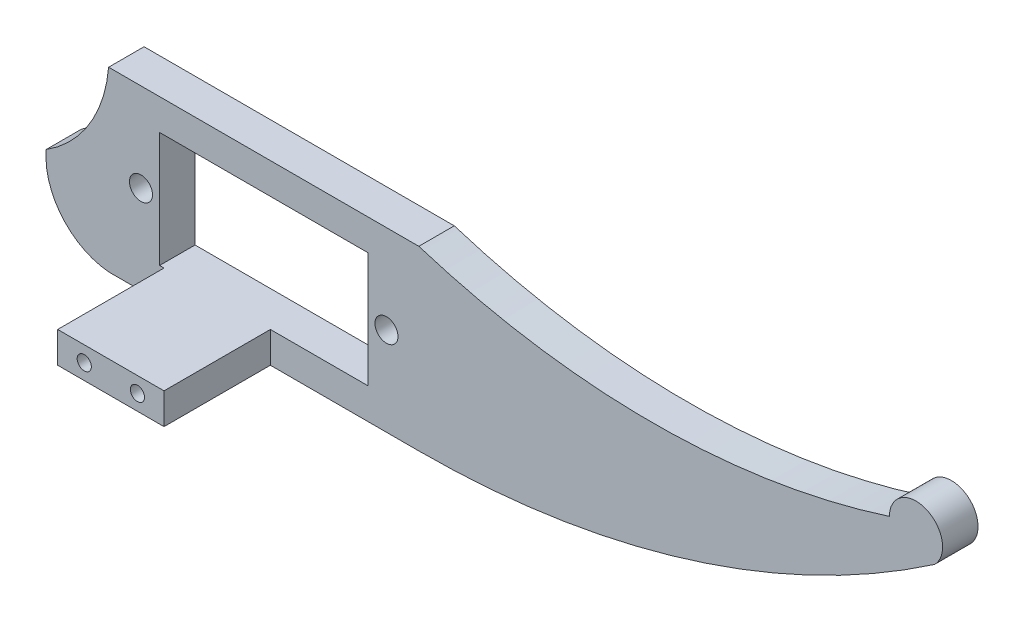
ISO-10303-21;
HEADER;
FILE_DESCRIPTION(('STEP AP214'),'2;1');
FILE_NAME('part.step','',(''),(''),'','','');
FILE_SCHEMA(('AUTOMOTIVE_DESIGN { 1 0 10303 214 1 1 1 1 }'));
ENDSEC;
DATA;
#1=APPLICATION_CONTEXT('core data for automotive mechanical design processes');
#2=APPLICATION_PROTOCOL_DEFINITION('international standard','automotive_design',2000,#1);
#3=PRODUCT_CONTEXT('',#1,'mechanical');
#4=PRODUCT('Part','Part','',(#3));
#5=PRODUCT_RELATED_PRODUCT_CATEGORY('part','',(#4));
#6=PRODUCT_DEFINITION_FORMATION('','',#4);
#7=PRODUCT_DEFINITION_CONTEXT('part definition',#1,'design');
#8=PRODUCT_DEFINITION('design','',#6,#7);
#9=PRODUCT_DEFINITION_SHAPE('','',#8);
#10=(LENGTH_UNIT() NAMED_UNIT(*) SI_UNIT(.MILLI.,.METRE.));
#11=(NAMED_UNIT(*) PLANE_ANGLE_UNIT() SI_UNIT($,.RADIAN.));
#12=(NAMED_UNIT(*) SI_UNIT($,.STERADIAN.) SOLID_ANGLE_UNIT());
#13=UNCERTAINTY_MEASURE_WITH_UNIT(LENGTH_MEASURE(1.E-05),#10,'distance_accuracy_value','');
#14=(GEOMETRIC_REPRESENTATION_CONTEXT(3) GLOBAL_UNCERTAINTY_ASSIGNED_CONTEXT((#13)) GLOBAL_UNIT_ASSIGNED_CONTEXT((#10,
#11,#12)) REPRESENTATION_CONTEXT('',''));
#15=CARTESIAN_POINT('',(0.,0.,0.));
#16=DIRECTION('',(0.,0.,1.));
#17=DIRECTION('',(1.,0.,0.));
#18=AXIS2_PLACEMENT_3D('',#15,#16,#17);
#19=CARTESIAN_POINT('',(0.,0.,4.));
#20=DIRECTION('',(0.,0.,1.));
#21=DIRECTION('',(1.,0.,0.));
#22=AXIS2_PLACEMENT_3D('',#19,#20,#21);
#23=PLANE('',#22);
#24=CARTESIAN_POINT('',(21.2104677769309,-2.6376373313008,4.));
#25=DIRECTION('',(0.,0.,1.));
#26=DIRECTION('',(1.,0.,0.));
#27=AXIS2_PLACEMENT_3D('',#24,#25,#26);
#28=CIRCLE('',#27,1.3);
#29=CARTESIAN_POINT('',(22.5104677769309,-2.6376373313008,4.));
#30=VERTEX_POINT('',#29);
#31=EDGE_CURVE('E346',#30,#30,#28,.T.);
#32=ORIENTED_EDGE('',*,*,#31,.F.);
#33=EDGE_LOOP('',(#32));
#34=FACE_BOUND('',#33,.T.);
#35=CARTESIAN_POINT('',(-6.48953222306909,-2.63763733130083,4.));
#36=DIRECTION('',(0.,0.,1.));
#37=DIRECTION('',(1.,0.,0.));
#38=AXIS2_PLACEMENT_3D('',#35,#36,#37);
#39=CIRCLE('',#38,1.3);
#40=CARTESIAN_POINT('',(-5.18953222306909,-2.63763733130083,4.));
#41=VERTEX_POINT('',#40);
#42=EDGE_CURVE('E342',#41,#41,#39,.T.);
#43=ORIENTED_EDGE('',*,*,#42,.F.);
#44=EDGE_LOOP('',(#43));
#45=FACE_BOUND('',#44,.T.);
#46=DIRECTION('',(1.,0.,0.));
#47=VECTOR('',#46,1.);
#48=CARTESIAN_POINT('',(0.,-9.1376373313008,4.));
#49=LINE('',#48,#47);
#50=CARTESIAN_POINT('',(8.11046777693084,-9.1376373313008,4.));
#51=VERTEX_POINT('',#50);
#52=CARTESIAN_POINT('',(19.1104677769309,-9.1376373313008,4.));
#53=VERTEX_POINT('',#52);
#54=EDGE_CURVE('E315',#51,#53,#49,.T.);
#55=ORIENTED_EDGE('',*,*,#54,.F.);
#56=DIRECTION('',(0.,-1.,0.));
#57=VECTOR('',#56,1.);
#58=CARTESIAN_POINT('',(8.11046777693084,-9.1376373313008,4.));
#59=LINE('',#58,#57);
#60=CARTESIAN_POINT('',(8.11046777693084,-12.6376373313008,4.));
#61=VERTEX_POINT('',#60);
#62=EDGE_CURVE('E320',#51,#61,#59,.T.);
#63=ORIENTED_EDGE('',*,*,#62,.T.);
#64=DIRECTION('',(1.,0.,0.));
#65=VECTOR('',#64,1.);
#66=CARTESIAN_POINT('',(0.,-12.6376373313008,4.));
#67=LINE('',#66,#65);
#68=CARTESIAN_POINT('',(24.8604677769309,-12.6376373313008,4.));
#69=VERTEX_POINT('',#68);
#70=EDGE_CURVE('E288',#61,#69,#67,.T.);
#71=ORIENTED_EDGE('',*,*,#70,.T.);
#72=CARTESIAN_POINT('',(24.8604677769309,90.3991290333978,4.));
#73=DIRECTION('',(0.,0.,1.));
#74=DIRECTION('',(1.,0.,0.));
#75=AXIS2_PLACEMENT_3D('',#72,#73,#74);
#76=CIRCLE('',#75,103.036766364699);
#77=CARTESIAN_POINT('',(83.0359638887343,5.35686380581207,4.));
#78=VERTEX_POINT('',#77);
#79=EDGE_CURVE('E287',#69,#78,#76,.T.);
#80=ORIENTED_EDGE('',*,*,#79,.T.);
#81=CARTESIAN_POINT('',(80.9569407255194,7.51965429192378,4.));
#82=DIRECTION('',(0.,0.,1.));
#83=DIRECTION('',(1.,0.,0.));
#84=AXIS2_PLACEMENT_3D('',#81,#82,#83);
#85=CIRCLE('',#84,2.99999999999991);
#86=CARTESIAN_POINT('',(77.9569407255195,7.51965429192378,4.));
#87=VERTEX_POINT('',#86);
#88=EDGE_CURVE('E165',#78,#87,#85,.T.);
#89=ORIENTED_EDGE('',*,*,#88,.T.);
#90=CARTESIAN_POINT('',(51.1624750782054,90.5598698435227,4.));
#91=DIRECTION('',(0.,0.,1.));
#92=DIRECTION('',(1.,0.,0.));
#93=AXIS2_PLACEMENT_3D('',#90,#91,#92);
#94=CIRCLE('',#93,87.2560644779553);
#95=CARTESIAN_POINT('',(24.8604677769309,7.3623626686992,4.));
#96=VERTEX_POINT('',#95);
#97=EDGE_CURVE('E163',#96,#87,#94,.T.);
#98=ORIENTED_EDGE('',*,*,#97,.F.);
#99=DIRECTION('',(1.,0.,0.));
#100=VECTOR('',#99,1.);
#101=CARTESIAN_POINT('',(0.,7.3623626686992,4.));
#102=LINE('',#101,#100);
#103=CARTESIAN_POINT('',(-10.1395322230691,7.3623626686992,4.));
#104=VERTEX_POINT('',#103);
#105=EDGE_CURVE('E144',#104,#96,#102,.T.);
#106=ORIENTED_EDGE('',*,*,#105,.F.);
#107=CARTESIAN_POINT('',(-25.2144187686787,8.61927416825423,4.));
#108=DIRECTION('',(0.,0.,1.));
#109=DIRECTION('',(1.,0.,0.));
#110=AXIS2_PLACEMENT_3D('',#107,#108,#109);
#111=CIRCLE('',#110,15.1271950764415);
#112=CARTESIAN_POINT('',(-17.1781884954032,-4.19677178498755,4.));
#113=VERTEX_POINT('',#112);
#114=EDGE_CURVE('E154',#104,#113,#111,.F.);
#115=ORIENTED_EDGE('',*,*,#114,.T.);
#116=CARTESIAN_POINT('',(-9.43842758607949,-4.89787642197714,4.));
#117=DIRECTION('',(0.,0.,1.));
#118=DIRECTION('',(1.,0.,0.));
#119=AXIS2_PLACEMENT_3D('',#116,#117,#118);
#120=CIRCLE('',#119,7.77145074265435);
#121=CARTESIAN_POINT('',(-10.1395322230691,-12.6376373313008,4.));
#122=VERTEX_POINT('',#121);
#123=EDGE_CURVE('E158',#122,#113,#120,.F.);
#124=ORIENTED_EDGE('',*,*,#123,.F.);
#125=CARTESIAN_POINT('',(-3.88953222306916,-12.6376373313008,4.));
#126=VERTEX_POINT('',#125);
#127=EDGE_CURVE('E283',#122,#126,#67,.T.);
#128=ORIENTED_EDGE('',*,*,#127,.T.);
#129=DIRECTION('',(0.,1.,0.));
#130=VECTOR('',#129,1.);
#131=CARTESIAN_POINT('',(-3.88953222306916,-9.1376373313008,4.));
#132=LINE('',#131,#130);
#133=CARTESIAN_POINT('',(-3.88953222306916,-9.1376373313008,4.));
#134=VERTEX_POINT('',#133);
#135=EDGE_CURVE('E284',#126,#134,#132,.T.);
#136=ORIENTED_EDGE('',*,*,#135,.T.);
#137=CARTESIAN_POINT('',(-4.38953222306909,-9.1376373313008,4.));
#138=VERTEX_POINT('',#137);
#139=EDGE_CURVE('E323',#138,#134,#49,.T.);
#140=ORIENTED_EDGE('',*,*,#139,.F.);
#141=DIRECTION('',(0.,-1.,0.));
#142=VECTOR('',#141,1.);
#143=CARTESIAN_POINT('',(-4.38953222306909,0.,4.));
#144=LINE('',#143,#142);
#145=CARTESIAN_POINT('',(-4.38953222306909,3.8623626686992,4.));
#146=VERTEX_POINT('',#145);
#147=EDGE_CURVE('E226',#146,#138,#144,.T.);
#148=ORIENTED_EDGE('',*,*,#147,.F.);
#149=DIRECTION('',(1.,0.,0.));
#150=VECTOR('',#149,1.);
#151=CARTESIAN_POINT('',(0.,3.8623626686992,4.));
#152=LINE('',#151,#150);
#153=CARTESIAN_POINT('',(19.1104677769309,3.8623626686992,4.));
#154=VERTEX_POINT('',#153);
#155=EDGE_CURVE('E200',#146,#154,#152,.T.);
#156=ORIENTED_EDGE('',*,*,#155,.T.);
#157=DIRECTION('',(0.,-1.,0.));
#158=VECTOR('',#157,1.);
#159=CARTESIAN_POINT('',(19.1104677769309,0.,4.));
#160=LINE('',#159,#158);
#161=EDGE_CURVE('E111',#154,#53,#160,.T.);
#162=ORIENTED_EDGE('',*,*,#161,.T.);
#163=EDGE_LOOP('',(#55,#63,#71,#80,#89,#98,#106,#115,#124,#128,#136,#140,#148,#156,#162));
#164=FACE_BOUND('',#163,.T.);
#165=ADVANCED_FACE('F36',(#34,#45,#164),#23,.T.);
#166=CARTESIAN_POINT('',(0.,-12.6376373313008,4.));
#167=DIRECTION('',(0.,1.,0.));
#168=DIRECTION('',(0.,0.,1.));
#169=AXIS2_PLACEMENT_3D('',#166,#167,#168);
#170=PLANE('',#169);
#171=DIRECTION('',(1.,0.,0.));
#172=VECTOR('',#171,1.);
#173=CARTESIAN_POINT('',(0.,-12.6376373313008,0.));
#174=LINE('',#173,#172);
#175=CARTESIAN_POINT('',(-10.1395322230691,-12.6376373313008,0.));
#176=VERTEX_POINT('',#175);
#177=CARTESIAN_POINT('',(24.8604677769309,-12.6376373313008,0.));
#178=VERTEX_POINT('',#177);
#179=EDGE_CURVE('E184',#176,#178,#174,.T.);
#180=ORIENTED_EDGE('',*,*,#179,.T.);
#181=DIRECTION('',(0.,0.,-1.));
#182=VECTOR('',#181,1.);
#183=CARTESIAN_POINT('',(24.8604677769309,-12.6376373313008,4.));
#184=LINE('',#183,#182);
#185=EDGE_CURVE('E11',#69,#178,#184,.T.);
#186=ORIENTED_EDGE('',*,*,#185,.F.);
#187=ORIENTED_EDGE('',*,*,#70,.F.);
#188=DIRECTION('',(0.,0.,-1.));
#189=VECTOR('',#188,1.);
#190=CARTESIAN_POINT('',(8.11046777693084,-12.6376373313008,16.));
#191=LINE('',#190,#189);
#192=CARTESIAN_POINT('',(8.11046777693084,-12.6376373313008,16.));
#193=VERTEX_POINT('',#192);
#194=EDGE_CURVE('E299',#193,#61,#191,.T.);
#195=ORIENTED_EDGE('',*,*,#194,.F.);
#196=DIRECTION('',(-1.,0.,0.));
#197=VECTOR('',#196,1.);
#198=CARTESIAN_POINT('',(8.11046777693084,-12.6376373313008,16.));
#199=LINE('',#198,#197);
#200=CARTESIAN_POINT('',(-3.88953222306916,-12.6376373313008,16.));
#201=VERTEX_POINT('',#200);
#202=EDGE_CURVE('E336',#193,#201,#199,.T.);
#203=ORIENTED_EDGE('',*,*,#202,.T.);
#204=DIRECTION('',(0.,0.,-1.));
#205=VECTOR('',#204,1.);
#206=CARTESIAN_POINT('',(-3.88953222306916,-12.6376373313008,16.));
#207=LINE('',#206,#205);
#208=EDGE_CURVE('E328',#201,#126,#207,.T.);
#209=ORIENTED_EDGE('',*,*,#208,.T.);
#210=ORIENTED_EDGE('',*,*,#127,.F.);
#211=DIRECTION('',(0.,0.,-1.));
#212=VECTOR('',#211,1.);
#213=CARTESIAN_POINT('',(-10.1395322230691,-12.6376373313008,4.));
#214=LINE('',#213,#212);
#215=EDGE_CURVE('E62',#122,#176,#214,.T.);
#216=ORIENTED_EDGE('',*,*,#215,.T.);
#217=EDGE_LOOP('',(#180,#186,#187,#195,#203,#209,#210,#216));
#218=FACE_BOUND('',#217,.T.);
#219=ADVANCED_FACE('F239',(#218),#170,.F.);
#220=CARTESIAN_POINT('',(24.8604677769309,90.3991290333978,4.));
#221=DIRECTION('',(0.,0.,-1.));
#222=DIRECTION('',(-1.,0.,0.));
#223=AXIS2_PLACEMENT_3D('',#220,#221,#222);
#224=CYLINDRICAL_SURFACE('',#223,103.036766364699);
#225=CARTESIAN_POINT('',(24.8604677769309,90.3991290333978,0.));
#226=DIRECTION('',(0.,0.,1.));
#227=DIRECTION('',(1.,0.,0.));
#228=AXIS2_PLACEMENT_3D('',#225,#226,#227);
#229=CIRCLE('',#228,103.036766364699);
#230=CARTESIAN_POINT('',(83.0359638887343,5.35686380581207,0.));
#231=VERTEX_POINT('',#230);
#232=EDGE_CURVE('E186',#178,#231,#229,.T.);
#233=ORIENTED_EDGE('',*,*,#232,.T.);
#234=DIRECTION('',(0.,0.,-1.));
#235=VECTOR('',#234,1.);
#236=CARTESIAN_POINT('',(83.0359638887343,5.35686380581207,4.));
#237=LINE('',#236,#235);
#238=EDGE_CURVE('E45',#78,#231,#237,.T.);
#239=ORIENTED_EDGE('',*,*,#238,.F.);
#240=ORIENTED_EDGE('',*,*,#79,.F.);
#241=ORIENTED_EDGE('',*,*,#185,.T.);
#242=EDGE_LOOP('',(#233,#239,#240,#241));
#243=FACE_BOUND('',#242,.T.);
#244=ADVANCED_FACE('F245',(#243),#224,.T.);
#245=CARTESIAN_POINT('',(80.9569407255194,7.51965429192378,4.));
#246=DIRECTION('',(0.,0.,-1.));
#247=DIRECTION('',(-1.,0.,0.));
#248=AXIS2_PLACEMENT_3D('',#245,#246,#247);
#249=CYLINDRICAL_SURFACE('',#248,2.99999999999991);
#250=CARTESIAN_POINT('',(80.9569407255194,7.51965429192378,0.));
#251=DIRECTION('',(0.,0.,1.));
#252=DIRECTION('',(1.,0.,0.));
#253=AXIS2_PLACEMENT_3D('',#250,#251,#252);
#254=CIRCLE('',#253,2.99999999999991);
#255=CARTESIAN_POINT('',(77.9569407255195,7.51965429192378,0.));
#256=VERTEX_POINT('',#255);
#257=EDGE_CURVE('E188',#231,#256,#254,.T.);
#258=ORIENTED_EDGE('',*,*,#257,.T.);
#259=DIRECTION('',(0.,0.,-1.));
#260=VECTOR('',#259,1.);
#261=CARTESIAN_POINT('',(77.9569407255195,7.51965429192378,4.));
#262=LINE('',#261,#260);
#263=EDGE_CURVE('E204',#87,#256,#262,.T.);
#264=ORIENTED_EDGE('',*,*,#263,.F.);
#265=ORIENTED_EDGE('',*,*,#88,.F.);
#266=ORIENTED_EDGE('',*,*,#238,.T.);
#267=EDGE_LOOP('',(#258,#264,#265,#266));
#268=FACE_BOUND('',#267,.T.);
#269=ADVANCED_FACE('F265',(#268),#249,.T.);
#270=CARTESIAN_POINT('',(51.1624750782054,90.5598698435227,4.));
#271=DIRECTION('',(0.,0.,-1.));
#272=DIRECTION('',(-1.,0.,0.));
#273=AXIS2_PLACEMENT_3D('',#270,#271,#272);
#274=CYLINDRICAL_SURFACE('',#273,87.2560644779553);
#275=CARTESIAN_POINT('',(51.1624750782054,90.5598698435227,0.));
#276=DIRECTION('',(0.,0.,1.));
#277=DIRECTION('',(1.,0.,0.));
#278=AXIS2_PLACEMENT_3D('',#275,#276,#277);
#279=CIRCLE('',#278,87.2560644779553);
#280=CARTESIAN_POINT('',(24.8604677769309,7.3623626686992,0.));
#281=VERTEX_POINT('',#280);
#282=EDGE_CURVE('E191',#281,#256,#279,.T.);
#283=ORIENTED_EDGE('',*,*,#282,.F.);
#284=DIRECTION('',(0.,0.,-1.));
#285=VECTOR('',#284,1.);
#286=CARTESIAN_POINT('',(24.8604677769309,7.3623626686992,4.));
#287=LINE('',#286,#285);
#288=EDGE_CURVE('E150',#96,#281,#287,.T.);
#289=ORIENTED_EDGE('',*,*,#288,.F.);
#290=ORIENTED_EDGE('',*,*,#97,.T.);
#291=ORIENTED_EDGE('',*,*,#263,.T.);
#292=EDGE_LOOP('',(#283,#289,#290,#291));
#293=FACE_BOUND('',#292,.T.);
#294=ADVANCED_FACE('F262',(#293),#274,.F.);
#295=CARTESIAN_POINT('',(0.,7.3623626686992,4.));
#296=DIRECTION('',(0.,1.,0.));
#297=DIRECTION('',(0.,0.,1.));
#298=AXIS2_PLACEMENT_3D('',#295,#296,#297);
#299=PLANE('',#298);
#300=DIRECTION('',(1.,0.,0.));
#301=VECTOR('',#300,1.);
#302=CARTESIAN_POINT('',(0.,7.3623626686992,0.));
#303=LINE('',#302,#301);
#304=CARTESIAN_POINT('',(-10.1395322230691,7.3623626686992,0.));
#305=VERTEX_POINT('',#304);
#306=EDGE_CURVE('E146',#305,#281,#303,.T.);
#307=ORIENTED_EDGE('',*,*,#306,.F.);
#308=DIRECTION('',(0.,0.,-1.));
#309=VECTOR('',#308,1.);
#310=CARTESIAN_POINT('',(-10.1395322230691,7.3623626686992,4.));
#311=LINE('',#310,#309);
#312=EDGE_CURVE('E140',#104,#305,#311,.T.);
#313=ORIENTED_EDGE('',*,*,#312,.F.);
#314=ORIENTED_EDGE('',*,*,#105,.T.);
#315=ORIENTED_EDGE('',*,*,#288,.T.);
#316=EDGE_LOOP('',(#307,#313,#314,#315));
#317=FACE_BOUND('',#316,.T.);
#318=ADVANCED_FACE('F142',(#317),#299,.T.);
#319=CARTESIAN_POINT('',(-25.2144187686787,8.61927416825423,4.));
#320=DIRECTION('',(0.,0.,-1.));
#321=DIRECTION('',(-1.,0.,0.));
#322=AXIS2_PLACEMENT_3D('',#319,#320,#321);
#323=CYLINDRICAL_SURFACE('',#322,15.1271950764415);
#324=CARTESIAN_POINT('',(-25.2144187686787,8.61927416825423,0.));
#325=DIRECTION('',(0.,0.,1.));
#326=DIRECTION('',(1.,0.,0.));
#327=AXIS2_PLACEMENT_3D('',#324,#325,#326);
#328=CIRCLE('',#327,15.1271950764415);
#329=CARTESIAN_POINT('',(-17.1781884954032,-4.19677178498755,0.));
#330=VERTEX_POINT('',#329);
#331=EDGE_CURVE('E195',#305,#330,#328,.F.);
#332=ORIENTED_EDGE('',*,*,#331,.T.);
#333=DIRECTION('',(0.,0.,-1.));
#334=VECTOR('',#333,1.);
#335=CARTESIAN_POINT('',(-17.1781884954032,-4.19677178498755,4.));
#336=LINE('',#335,#334);
#337=EDGE_CURVE('E151',#113,#330,#336,.T.);
#338=ORIENTED_EDGE('',*,*,#337,.F.);
#339=ORIENTED_EDGE('',*,*,#114,.F.);
#340=ORIENTED_EDGE('',*,*,#312,.T.);
#341=EDGE_LOOP('',(#332,#338,#339,#340));
#342=FACE_BOUND('',#341,.T.);
#343=ADVANCED_FACE('F155',(#342),#323,.F.);
#344=CARTESIAN_POINT('',(0.,3.8623626686992,4.));
#345=DIRECTION('',(0.,1.,0.));
#346=DIRECTION('',(-1.,0.,0.));
#347=AXIS2_PLACEMENT_3D('',#344,#345,#346);
#348=PLANE('',#347);
#349=DIRECTION('',(1.,0.,0.));
#350=VECTOR('',#349,1.);
#351=CARTESIAN_POINT('',(0.,3.8623626686992,0.));
#352=LINE('',#351,#350);
#353=CARTESIAN_POINT('',(-4.38953222306909,3.8623626686992,0.));
#354=VERTEX_POINT('',#353);
#355=CARTESIAN_POINT('',(19.1104677769309,3.8623626686992,0.));
#356=VERTEX_POINT('',#355);
#357=EDGE_CURVE('E171',#354,#356,#352,.T.);
#358=ORIENTED_EDGE('',*,*,#357,.T.);
#359=DIRECTION('',(0.,0.,-1.));
#360=VECTOR('',#359,1.);
#361=CARTESIAN_POINT('',(19.1104677769309,3.8623626686992,4.));
#362=LINE('',#361,#360);
#363=EDGE_CURVE('E40',#154,#356,#362,.T.);
#364=ORIENTED_EDGE('',*,*,#363,.F.);
#365=ORIENTED_EDGE('',*,*,#155,.F.);
#366=DIRECTION('',(0.,0.,-1.));
#367=VECTOR('',#366,1.);
#368=CARTESIAN_POINT('',(-4.38953222306909,3.8623626686992,4.));
#369=LINE('',#368,#367);
#370=EDGE_CURVE('E170',#146,#354,#369,.T.);
#371=ORIENTED_EDGE('',*,*,#370,.T.);
#372=EDGE_LOOP('',(#358,#364,#365,#371));
#373=FACE_BOUND('',#372,.T.);
#374=ADVANCED_FACE('F38',(#373),#348,.F.);
#375=CARTESIAN_POINT('',(19.1104677769309,0.,4.));
#376=DIRECTION('',(1.,0.,0.));
#377=DIRECTION('',(0.,1.,0.));
#378=AXIS2_PLACEMENT_3D('',#375,#376,#377);
#379=PLANE('',#378);
#380=DIRECTION('',(0.,-1.,0.));
#381=VECTOR('',#380,1.);
#382=CARTESIAN_POINT('',(19.1104677769309,0.,0.));
#383=LINE('',#382,#381);
#384=CARTESIAN_POINT('',(19.1104677769309,-9.1376373313008,0.));
#385=VERTEX_POINT('',#384);
#386=EDGE_CURVE('E174',#356,#385,#383,.T.);
#387=ORIENTED_EDGE('',*,*,#386,.T.);
#388=DIRECTION('',(0.,0.,-1.));
#389=VECTOR('',#388,1.);
#390=CARTESIAN_POINT('',(19.1104677769309,-9.1376373313008,4.));
#391=LINE('',#390,#389);
#392=EDGE_CURVE('E210',#53,#385,#391,.T.);
#393=ORIENTED_EDGE('',*,*,#392,.F.);
#394=ORIENTED_EDGE('',*,*,#161,.F.);
#395=ORIENTED_EDGE('',*,*,#363,.T.);
#396=EDGE_LOOP('',(#387,#393,#394,#395));
#397=FACE_BOUND('',#396,.T.);
#398=ADVANCED_FACE('F214',(#397),#379,.F.);
#399=CARTESIAN_POINT('',(0.,-9.1376373313008,4.));
#400=DIRECTION('',(0.,1.,0.));
#401=DIRECTION('',(0.,0.,1.));
#402=AXIS2_PLACEMENT_3D('',#399,#400,#401);
#403=PLANE('',#402);
#404=DIRECTION('',(1.,0.,0.));
#405=VECTOR('',#404,1.);
#406=CARTESIAN_POINT('',(0.,-9.1376373313008,0.));
#407=LINE('',#406,#405);
#408=CARTESIAN_POINT('',(-4.38953222306909,-9.1376373313008,0.));
#409=VERTEX_POINT('',#408);
#410=EDGE_CURVE('E178',#409,#385,#407,.T.);
#411=ORIENTED_EDGE('',*,*,#410,.F.);
#412=DIRECTION('',(0.,0.,-1.));
#413=VECTOR('',#412,1.);
#414=CARTESIAN_POINT('',(-4.38953222306909,-9.1376373313008,4.));
#415=LINE('',#414,#413);
#416=EDGE_CURVE('E209',#138,#409,#415,.T.);
#417=ORIENTED_EDGE('',*,*,#416,.F.);
#418=ORIENTED_EDGE('',*,*,#139,.T.);
#419=DIRECTION('',(0.,0.,-1.));
#420=VECTOR('',#419,1.);
#421=CARTESIAN_POINT('',(-3.88953222306916,-9.1376373313008,16.));
#422=LINE('',#421,#420);
#423=CARTESIAN_POINT('',(-3.88953222306916,-9.1376373313008,16.));
#424=VERTEX_POINT('',#423);
#425=EDGE_CURVE('E53',#424,#134,#422,.T.);
#426=ORIENTED_EDGE('',*,*,#425,.F.);
#427=DIRECTION('',(1.,0.,0.));
#428=VECTOR('',#427,1.);
#429=CARTESIAN_POINT('',(8.11046777693084,-9.1376373313008,16.));
#430=LINE('',#429,#428);
#431=CARTESIAN_POINT('',(8.11046777693084,-9.1376373313008,16.));
#432=VERTEX_POINT('',#431);
#433=EDGE_CURVE('E317',#424,#432,#430,.T.);
#434=ORIENTED_EDGE('',*,*,#433,.T.);
#435=DIRECTION('',(0.,0.,-1.));
#436=VECTOR('',#435,1.);
#437=CARTESIAN_POINT('',(8.11046777693084,-9.1376373313008,16.));
#438=LINE('',#437,#436);
#439=EDGE_CURVE('E175',#432,#51,#438,.T.);
#440=ORIENTED_EDGE('',*,*,#439,.T.);
#441=ORIENTED_EDGE('',*,*,#54,.T.);
#442=ORIENTED_EDGE('',*,*,#392,.T.);
#443=EDGE_LOOP('',(#411,#417,#418,#426,#434,#440,#441,#442));
#444=FACE_BOUND('',#443,.T.);
#445=ADVANCED_FACE('F229',(#444),#403,.T.);
#446=CARTESIAN_POINT('',(-4.38953222306909,0.,4.));
#447=DIRECTION('',(1.,0.,0.));
#448=DIRECTION('',(0.,1.,0.));
#449=AXIS2_PLACEMENT_3D('',#446,#447,#448);
#450=PLANE('',#449);
#451=DIRECTION('',(0.,-1.,0.));
#452=VECTOR('',#451,1.);
#453=CARTESIAN_POINT('',(-4.38953222306909,0.,0.));
#454=LINE('',#453,#452);
#455=EDGE_CURVE('E181',#354,#409,#454,.T.);
#456=ORIENTED_EDGE('',*,*,#455,.F.);
#457=ORIENTED_EDGE('',*,*,#370,.F.);
#458=ORIENTED_EDGE('',*,*,#147,.T.);
#459=ORIENTED_EDGE('',*,*,#416,.T.);
#460=EDGE_LOOP('',(#456,#457,#458,#459));
#461=FACE_BOUND('',#460,.T.);
#462=ADVANCED_FACE('F223',(#461),#450,.T.);
#463=CARTESIAN_POINT('',(-9.43842758607949,-4.89787642197714,4.));
#464=DIRECTION('',(0.,0.,-1.));
#465=DIRECTION('',(-1.,0.,0.));
#466=AXIS2_PLACEMENT_3D('',#463,#464,#465);
#467=CYLINDRICAL_SURFACE('',#466,7.77145074265435);
#468=CARTESIAN_POINT('',(-9.43842758607949,-4.89787642197714,0.));
#469=DIRECTION('',(0.,0.,1.));
#470=DIRECTION('',(1.,0.,0.));
#471=AXIS2_PLACEMENT_3D('',#468,#469,#470);
#472=CIRCLE('',#471,7.77145074265435);
#473=EDGE_CURVE('E197',#176,#330,#472,.F.);
#474=ORIENTED_EDGE('',*,*,#473,.F.);
#475=ORIENTED_EDGE('',*,*,#215,.F.);
#476=ORIENTED_EDGE('',*,*,#123,.T.);
#477=ORIENTED_EDGE('',*,*,#337,.T.);
#478=EDGE_LOOP('',(#474,#475,#476,#477));
#479=FACE_BOUND('',#478,.T.);
#480=ADVANCED_FACE('F236',(#479),#467,.T.);
#481=CARTESIAN_POINT('',(0.,0.,0.));
#482=DIRECTION('',(0.,0.,1.));
#483=DIRECTION('',(1.,0.,0.));
#484=AXIS2_PLACEMENT_3D('',#481,#482,#483);
#485=PLANE('',#484);
#486=CARTESIAN_POINT('',(21.2104677769309,-2.6376373313008,0.));
#487=DIRECTION('',(0.,0.,1.));
#488=DIRECTION('',(1.,0.,0.));
#489=AXIS2_PLACEMENT_3D('',#486,#487,#488);
#490=CIRCLE('',#489,1.3);
#491=CARTESIAN_POINT('',(22.5104677769309,-2.6376373313008,0.));
#492=VERTEX_POINT('',#491);
#493=EDGE_CURVE('E321',#492,#492,#490,.T.);
#494=ORIENTED_EDGE('',*,*,#493,.T.);
#495=EDGE_LOOP('',(#494));
#496=FACE_BOUND('',#495,.T.);
#497=CARTESIAN_POINT('',(-6.48953222306909,-2.63763733130083,0.));
#498=DIRECTION('',(0.,0.,1.));
#499=DIRECTION('',(1.,0.,0.));
#500=AXIS2_PLACEMENT_3D('',#497,#498,#499);
#501=CIRCLE('',#500,1.3);
#502=CARTESIAN_POINT('',(-5.18953222306909,-2.63763733130083,0.));
#503=VERTEX_POINT('',#502);
#504=EDGE_CURVE('E339',#503,#503,#501,.T.);
#505=ORIENTED_EDGE('',*,*,#504,.T.);
#506=EDGE_LOOP('',(#505));
#507=FACE_BOUND('',#506,.T.);
#508=ORIENTED_EDGE('',*,*,#357,.F.);
#509=ORIENTED_EDGE('',*,*,#455,.T.);
#510=ORIENTED_EDGE('',*,*,#410,.T.);
#511=ORIENTED_EDGE('',*,*,#386,.F.);
#512=EDGE_LOOP('',(#508,#509,#510,#511));
#513=FACE_BOUND('',#512,.T.);
#514=ORIENTED_EDGE('',*,*,#179,.F.);
#515=ORIENTED_EDGE('',*,*,#473,.T.);
#516=ORIENTED_EDGE('',*,*,#331,.F.);
#517=ORIENTED_EDGE('',*,*,#306,.T.);
#518=ORIENTED_EDGE('',*,*,#282,.T.);
#519=ORIENTED_EDGE('',*,*,#257,.F.);
#520=ORIENTED_EDGE('',*,*,#232,.F.);
#521=EDGE_LOOP('',(#514,#515,#516,#517,#518,#519,#520));
#522=FACE_BOUND('',#521,.T.);
#523=ADVANCED_FACE('F220',(#496,#507,#513,#522),#485,.F.);
#524=CARTESIAN_POINT('',(8.11046777693084,-9.1376373313008,16.));
#525=DIRECTION('',(1.,0.,0.));
#526=DIRECTION('',(0.,0.,-1.));
#527=AXIS2_PLACEMENT_3D('',#524,#525,#526);
#528=PLANE('',#527);
#529=ORIENTED_EDGE('',*,*,#62,.F.);
#530=ORIENTED_EDGE('',*,*,#439,.F.);
#531=DIRECTION('',(0.,-1.,0.));
#532=VECTOR('',#531,1.);
#533=CARTESIAN_POINT('',(8.11046777693084,-9.1376373313008,16.));
#534=LINE('',#533,#532);
#535=EDGE_CURVE('E331',#432,#193,#534,.T.);
#536=ORIENTED_EDGE('',*,*,#535,.T.);
#537=ORIENTED_EDGE('',*,*,#194,.T.);
#538=EDGE_LOOP('',(#529,#530,#536,#537));
#539=FACE_BOUND('',#538,.T.);
#540=ADVANCED_FACE('F251',(#539),#528,.T.);
#541=CARTESIAN_POINT('',(-3.88953222306916,-9.1376373313008,16.));
#542=DIRECTION('',(-1.,0.,0.));
#543=DIRECTION('',(0.,0.,1.));
#544=AXIS2_PLACEMENT_3D('',#541,#542,#543);
#545=PLANE('',#544);
#546=ORIENTED_EDGE('',*,*,#135,.F.);
#547=ORIENTED_EDGE('',*,*,#208,.F.);
#548=DIRECTION('',(0.,1.,0.));
#549=VECTOR('',#548,1.);
#550=CARTESIAN_POINT('',(-3.88953222306916,-9.1376373313008,16.));
#551=LINE('',#550,#549);
#552=EDGE_CURVE('E334',#201,#424,#551,.T.);
#553=ORIENTED_EDGE('',*,*,#552,.T.);
#554=ORIENTED_EDGE('',*,*,#425,.T.);
#555=EDGE_LOOP('',(#546,#547,#553,#554));
#556=FACE_BOUND('',#555,.T.);
#557=ADVANCED_FACE('F376',(#556),#545,.T.);
#558=CARTESIAN_POINT('',(0.,0.,16.));
#559=DIRECTION('',(0.,0.,-1.));
#560=DIRECTION('',(-1.,0.,0.));
#561=AXIS2_PLACEMENT_3D('',#558,#559,#560);
#562=PLANE('',#561);
#563=CARTESIAN_POINT('',(5.11046777693038,-10.8876373313012,16.));
#564=DIRECTION('',(0.,0.,1.));
#565=DIRECTION('',(1.,0.,0.));
#566=AXIS2_PLACEMENT_3D('',#563,#564,#565);
#567=CIRCLE('',#566,0.800000000000637);
#568=CARTESIAN_POINT('',(5.91046777693102,-10.8876373313012,16.));
#569=VERTEX_POINT('',#568);
#570=EDGE_CURVE('E357',#569,#569,#567,.T.);
#571=ORIENTED_EDGE('',*,*,#570,.F.);
#572=EDGE_LOOP('',(#571));
#573=FACE_BOUND('',#572,.T.);
#574=CARTESIAN_POINT('',(-0.889532223069622,-10.8876373313012,16.));
#575=DIRECTION('',(0.,0.,1.));
#576=DIRECTION('',(1.,0.,0.));
#577=AXIS2_PLACEMENT_3D('',#574,#575,#576);
#578=CIRCLE('',#577,0.800000000000639);
#579=CARTESIAN_POINT('',(-0.0895322230689829,-10.8876373313012,16.));
#580=VERTEX_POINT('',#579);
#581=EDGE_CURVE('E354',#580,#580,#578,.T.);
#582=ORIENTED_EDGE('',*,*,#581,.F.);
#583=EDGE_LOOP('',(#582));
#584=FACE_BOUND('',#583,.T.);
#585=ORIENTED_EDGE('',*,*,#535,.F.);
#586=ORIENTED_EDGE('',*,*,#433,.F.);
#587=ORIENTED_EDGE('',*,*,#552,.F.);
#588=ORIENTED_EDGE('',*,*,#202,.F.);
#589=EDGE_LOOP('',(#585,#586,#587,#588));
#590=FACE_BOUND('',#589,.T.);
#591=ADVANCED_FACE('F372',(#573,#584,#590),#562,.F.);
#592=CARTESIAN_POINT('',(-6.48953222306909,-2.63763733130083,0.));
#593=DIRECTION('',(0.,0.,1.));
#594=DIRECTION('',(1.,0.,0.));
#595=AXIS2_PLACEMENT_3D('',#592,#593,#594);
#596=CYLINDRICAL_SURFACE('',#595,1.3);
#597=ORIENTED_EDGE('',*,*,#504,.F.);
#598=EDGE_LOOP('',(#597));
#599=FACE_BOUND('',#598,.T.);
#600=ORIENTED_EDGE('',*,*,#42,.T.);
#601=EDGE_LOOP('',(#600));
#602=FACE_BOUND('',#601,.T.);
#603=ADVANCED_FACE('F375',(#599,#602),#596,.F.);
#604=CARTESIAN_POINT('',(21.2104677769309,-2.6376373313008,0.));
#605=DIRECTION('',(0.,0.,1.));
#606=DIRECTION('',(1.,0.,0.));
#607=AXIS2_PLACEMENT_3D('',#604,#605,#606);
#608=CYLINDRICAL_SURFACE('',#607,1.3);
#609=ORIENTED_EDGE('',*,*,#493,.F.);
#610=EDGE_LOOP('',(#609));
#611=FACE_BOUND('',#610,.T.);
#612=ORIENTED_EDGE('',*,*,#31,.T.);
#613=EDGE_LOOP('',(#612));
#614=FACE_BOUND('',#613,.T.);
#615=ADVANCED_FACE('F388',(#611,#614),#608,.F.);
#616=CARTESIAN_POINT('',(-0.889532223069622,-10.8876373313012,13.));
#617=DIRECTION('',(0.,0.,1.));
#618=DIRECTION('',(1.,0.,0.));
#619=AXIS2_PLACEMENT_3D('',#616,#617,#618);
#620=CYLINDRICAL_SURFACE('',#619,0.800000000000639);
#621=CARTESIAN_POINT('',(-0.889532223069622,-10.8876373313012,13.));
#622=DIRECTION('',(0.,0.,1.));
#623=DIRECTION('',(1.,0.,0.));
#624=AXIS2_PLACEMENT_3D('',#621,#622,#623);
#625=CIRCLE('',#624,0.800000000000639);
#626=CARTESIAN_POINT('',(-0.0895322230689829,-10.8876373313012,13.));
#627=VERTEX_POINT('',#626);
#628=EDGE_CURVE('E351',#627,#627,#625,.T.);
#629=ORIENTED_EDGE('',*,*,#628,.F.);
#630=EDGE_LOOP('',(#629));
#631=FACE_BOUND('',#630,.T.);
#632=ORIENTED_EDGE('',*,*,#581,.T.);
#633=EDGE_LOOP('',(#632));
#634=FACE_BOUND('',#633,.T.);
#635=ADVANCED_FACE('F392',(#631,#634),#620,.F.);
#636=CARTESIAN_POINT('',(-0.889532223069622,-10.8876373313012,13.));
#637=DIRECTION('',(0.,0.,1.));
#638=DIRECTION('',(1.,0.,0.));
#639=AXIS2_PLACEMENT_3D('',#636,#637,#638);
#640=PLANE('',#639);
#641=ORIENTED_EDGE('',*,*,#628,.T.);
#642=EDGE_LOOP('',(#641));
#643=FACE_BOUND('',#642,.T.);
#644=ADVANCED_FACE('F368',(#643),#640,.T.);
#645=CARTESIAN_POINT('',(5.11046777693038,-10.8876373313012,13.));
#646=DIRECTION('',(0.,0.,1.));
#647=DIRECTION('',(1.,0.,0.));
#648=AXIS2_PLACEMENT_3D('',#645,#646,#647);
#649=CYLINDRICAL_SURFACE('',#648,0.800000000000637);
#650=CARTESIAN_POINT('',(5.11046777693038,-10.8876373313012,13.));
#651=DIRECTION('',(0.,0.,1.));
#652=DIRECTION('',(1.,0.,0.));
#653=AXIS2_PLACEMENT_3D('',#650,#651,#652);
#654=CIRCLE('',#653,0.800000000000637);
#655=CARTESIAN_POINT('',(5.91046777693102,-10.8876373313012,13.));
#656=VERTEX_POINT('',#655);
#657=EDGE_CURVE('E343',#656,#656,#654,.T.);
#658=ORIENTED_EDGE('',*,*,#657,.F.);
#659=EDGE_LOOP('',(#658));
#660=FACE_BOUND('',#659,.T.);
#661=ORIENTED_EDGE('',*,*,#570,.T.);
#662=EDGE_LOOP('',(#661));
#663=FACE_BOUND('',#662,.T.);
#664=ADVANCED_FACE('F365',(#660,#663),#649,.F.);
#665=CARTESIAN_POINT('',(5.11046777693038,-10.8876373313012,13.));
#666=DIRECTION('',(0.,0.,1.));
#667=DIRECTION('',(1.,0.,0.));
#668=AXIS2_PLACEMENT_3D('',#665,#666,#667);
#669=PLANE('',#668);
#670=ORIENTED_EDGE('',*,*,#657,.T.);
#671=EDGE_LOOP('',(#670));
#672=FACE_BOUND('',#671,.T.);
#673=ADVANCED_FACE('F363',(#672),#669,.T.);
#674=CLOSED_SHELL('',(#165,#219,#244,#269,#294,#318,#343,#374,#398,#445,#462,#480,#523,#540,
#557,#591,#603,#615,#635,#644,#664,#673));
#675=MANIFOLD_SOLID_BREP('B2',#674);
#676=ADVANCED_BREP_SHAPE_REPRESENTATION('',(#18,#675),#14);
#677=SHAPE_DEFINITION_REPRESENTATION(#9,#676);
ENDSEC;
END-ISO-10303-21;
